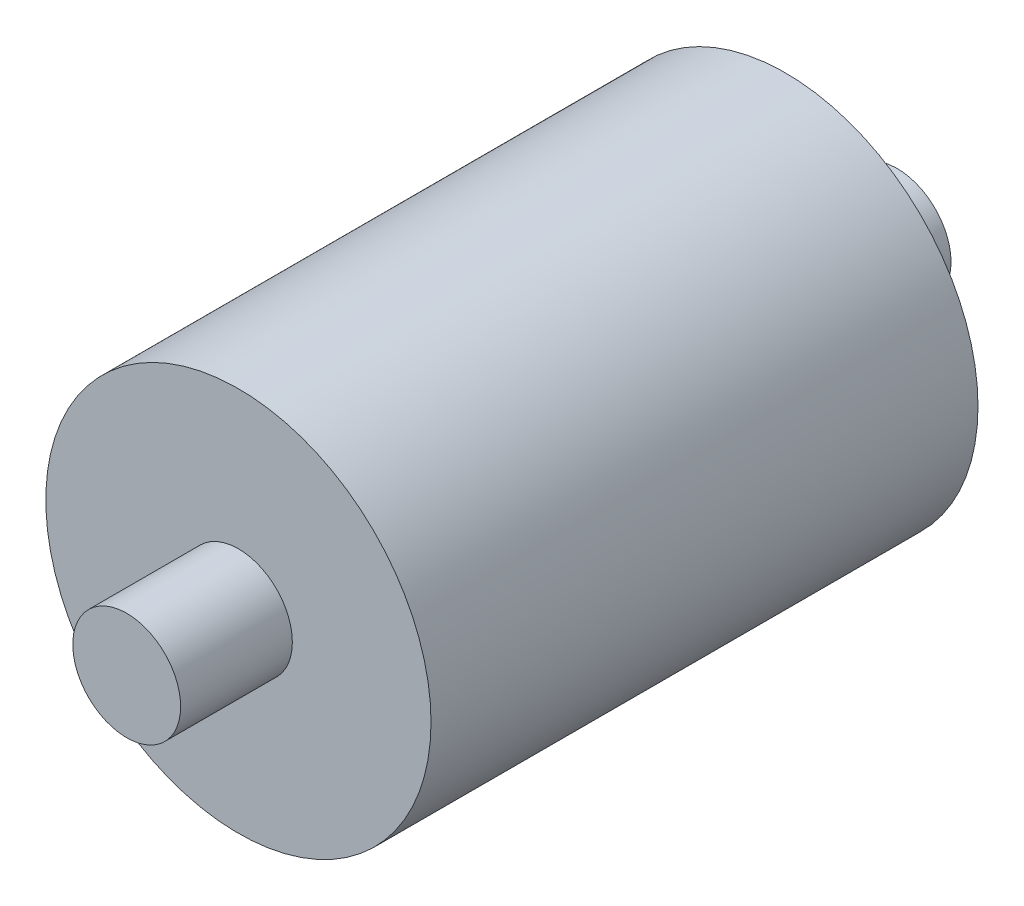
ISO-10303-21;
HEADER;
FILE_DESCRIPTION(('STEP AP214'),'2;1');
FILE_NAME('part.step','',(''),(''),'','','');
FILE_SCHEMA(('AUTOMOTIVE_DESIGN { 1 0 10303 214 1 1 1 1 }'));
ENDSEC;
DATA;
#1=APPLICATION_CONTEXT('core data for automotive mechanical design processes');
#2=APPLICATION_PROTOCOL_DEFINITION('international standard','automotive_design',2000,#1);
#3=PRODUCT_CONTEXT('',#1,'mechanical');
#4=PRODUCT('Part','Part','',(#3));
#5=PRODUCT_RELATED_PRODUCT_CATEGORY('part','',(#4));
#6=PRODUCT_DEFINITION_FORMATION('','',#4);
#7=PRODUCT_DEFINITION_CONTEXT('part definition',#1,'design');
#8=PRODUCT_DEFINITION('design','',#6,#7);
#9=PRODUCT_DEFINITION_SHAPE('','',#8);
#10=(LENGTH_UNIT() NAMED_UNIT(*) SI_UNIT(.MILLI.,.METRE.));
#11=(NAMED_UNIT(*) PLANE_ANGLE_UNIT() SI_UNIT($,.RADIAN.));
#12=(NAMED_UNIT(*) SI_UNIT($,.STERADIAN.) SOLID_ANGLE_UNIT());
#13=UNCERTAINTY_MEASURE_WITH_UNIT(LENGTH_MEASURE(1.E-05),#10,'distance_accuracy_value','');
#14=(GEOMETRIC_REPRESENTATION_CONTEXT(3) GLOBAL_UNCERTAINTY_ASSIGNED_CONTEXT((#13)) GLOBAL_UNIT_ASSIGNED_CONTEXT((#10,
#11,#12)) REPRESENTATION_CONTEXT('',''));
#15=CARTESIAN_POINT('',(0.,0.,0.));
#16=DIRECTION('',(0.,0.,1.));
#17=DIRECTION('',(1.,0.,0.));
#18=AXIS2_PLACEMENT_3D('',#15,#16,#17);
#19=CARTESIAN_POINT('',(0.,0.,35.5));
#20=DIRECTION('',(0.,0.,-1.));
#21=DIRECTION('',(-1.,0.,0.));
#22=AXIS2_PLACEMENT_3D('',#19,#20,#21);
#23=CYLINDRICAL_SURFACE('',#22,25.);
#24=CARTESIAN_POINT('',(0.,0.,35.5));
#25=DIRECTION('',(0.,0.,1.));
#26=DIRECTION('',(1.,0.,0.));
#27=AXIS2_PLACEMENT_3D('',#24,#25,#26);
#28=CIRCLE('',#27,25.);
#29=CARTESIAN_POINT('',(25.,0.,35.5));
#30=VERTEX_POINT('',#29);
#31=EDGE_CURVE('E36',#30,#30,#28,.T.);
#32=ORIENTED_EDGE('',*,*,#31,.F.);
#33=EDGE_LOOP('',(#32));
#34=FACE_BOUND('',#33,.T.);
#35=CARTESIAN_POINT('',(0.,0.,-35.5));
#36=DIRECTION('',(0.,0.,1.));
#37=DIRECTION('',(1.,0.,0.));
#38=AXIS2_PLACEMENT_3D('',#35,#36,#37);
#39=CIRCLE('',#38,25.);
#40=CARTESIAN_POINT('',(25.,0.,-35.5));
#41=VERTEX_POINT('',#40);
#42=EDGE_CURVE('E40',#41,#41,#39,.T.);
#43=ORIENTED_EDGE('',*,*,#42,.T.);
#44=EDGE_LOOP('',(#43));
#45=FACE_BOUND('',#44,.T.);
#46=ADVANCED_FACE('F30',(#34,#45),#23,.T.);
#47=CARTESIAN_POINT('',(0.,0.,35.5));
#48=DIRECTION('',(0.,0.,1.));
#49=DIRECTION('',(1.,0.,0.));
#50=AXIS2_PLACEMENT_3D('',#47,#48,#49);
#51=PLANE('',#50);
#52=CARTESIAN_POINT('',(0.,0.,35.5));
#53=DIRECTION('',(0.,0.,1.));
#54=DIRECTION('',(1.,0.,0.));
#55=AXIS2_PLACEMENT_3D('',#52,#53,#54);
#56=CIRCLE('',#55,7.);
#57=CARTESIAN_POINT('',(7.,0.,35.5));
#58=VERTEX_POINT('',#57);
#59=EDGE_CURVE('E45',#58,#58,#56,.F.);
#60=ORIENTED_EDGE('',*,*,#59,.T.);
#61=EDGE_LOOP('',(#60));
#62=FACE_BOUND('',#61,.T.);
#63=ORIENTED_EDGE('',*,*,#31,.T.);
#64=EDGE_LOOP('',(#63));
#65=FACE_BOUND('',#64,.T.);
#66=ADVANCED_FACE('F74',(#62,#65),#51,.T.);
#67=CARTESIAN_POINT('',(0.,0.,-35.5));
#68=DIRECTION('',(0.,0.,1.));
#69=DIRECTION('',(1.,0.,0.));
#70=AXIS2_PLACEMENT_3D('',#67,#68,#69);
#71=PLANE('',#70);
#72=CARTESIAN_POINT('',(0.,0.,-35.5));
#73=DIRECTION('',(0.,0.,1.));
#74=DIRECTION('',(1.,0.,0.));
#75=AXIS2_PLACEMENT_3D('',#72,#73,#74);
#76=CIRCLE('',#75,7.);
#77=CARTESIAN_POINT('',(7.,0.,-35.5));
#78=VERTEX_POINT('',#77);
#79=EDGE_CURVE('E10',#78,#78,#76,.F.);
#80=ORIENTED_EDGE('',*,*,#79,.F.);
#81=EDGE_LOOP('',(#80));
#82=FACE_BOUND('',#81,.T.);
#83=ORIENTED_EDGE('',*,*,#42,.F.);
#84=EDGE_LOOP('',(#83));
#85=FACE_BOUND('',#84,.T.);
#86=ADVANCED_FACE('F79',(#82,#85),#71,.F.);
#87=CARTESIAN_POINT('',(0.,0.,-50.));
#88=DIRECTION('',(0.,0.,1.));
#89=DIRECTION('',(1.,0.,0.));
#90=AXIS2_PLACEMENT_3D('',#87,#88,#89);
#91=PLANE('',#90);
#92=CARTESIAN_POINT('',(0.,0.,-50.));
#93=DIRECTION('',(0.,0.,1.));
#94=DIRECTION('',(1.,0.,0.));
#95=AXIS2_PLACEMENT_3D('',#92,#93,#94);
#96=CIRCLE('',#95,7.);
#97=CARTESIAN_POINT('',(7.,0.,-50.));
#98=VERTEX_POINT('',#97);
#99=EDGE_CURVE('E50',#98,#98,#96,.T.);
#100=ORIENTED_EDGE('',*,*,#99,.F.);
#101=EDGE_LOOP('',(#100));
#102=FACE_BOUND('',#101,.T.);
#103=ADVANCED_FACE('F68',(#102),#91,.F.);
#104=CARTESIAN_POINT('',(0.,0.,50.));
#105=DIRECTION('',(0.,0.,-1.));
#106=DIRECTION('',(-1.,0.,0.));
#107=AXIS2_PLACEMENT_3D('',#104,#105,#106);
#108=CYLINDRICAL_SURFACE('',#107,7.);
#109=ORIENTED_EDGE('',*,*,#99,.T.);
#110=EDGE_LOOP('',(#109));
#111=FACE_BOUND('',#110,.T.);
#112=ORIENTED_EDGE('',*,*,#79,.T.);
#113=EDGE_LOOP('',(#112));
#114=FACE_BOUND('',#113,.T.);
#115=ADVANCED_FACE('F60',(#111,#114),#108,.T.);
#116=ORIENTED_EDGE('',*,*,#59,.F.);
#117=EDGE_LOOP('',(#116));
#118=FACE_BOUND('',#117,.T.);
#119=CARTESIAN_POINT('',(0.,0.,50.));
#120=DIRECTION('',(0.,0.,1.));
#121=DIRECTION('',(1.,0.,0.));
#122=AXIS2_PLACEMENT_3D('',#119,#120,#121);
#123=CIRCLE('',#122,7.);
#124=CARTESIAN_POINT('',(7.,0.,50.));
#125=VERTEX_POINT('',#124);
#126=EDGE_CURVE('E49',#125,#125,#123,.T.);
#127=ORIENTED_EDGE('',*,*,#126,.F.);
#128=EDGE_LOOP('',(#127));
#129=FACE_BOUND('',#128,.T.);
#130=ADVANCED_FACE('F58',(#118,#129),#108,.T.);
#131=CARTESIAN_POINT('',(0.,0.,50.));
#132=DIRECTION('',(0.,0.,1.));
#133=DIRECTION('',(1.,0.,0.));
#134=AXIS2_PLACEMENT_3D('',#131,#132,#133);
#135=PLANE('',#134);
#136=ORIENTED_EDGE('',*,*,#126,.T.);
#137=EDGE_LOOP('',(#136));
#138=FACE_BOUND('',#137,.T.);
#139=ADVANCED_FACE('F56',(#138),#135,.T.);
#140=CLOSED_SHELL('',(#46,#66,#86,#103,#115,#130,#139));
#141=MANIFOLD_SOLID_BREP('B2',#140);
#142=ADVANCED_BREP_SHAPE_REPRESENTATION('',(#18,#141),#14);
#143=SHAPE_DEFINITION_REPRESENTATION(#9,#142);
ENDSEC;
END-ISO-10303-21;
